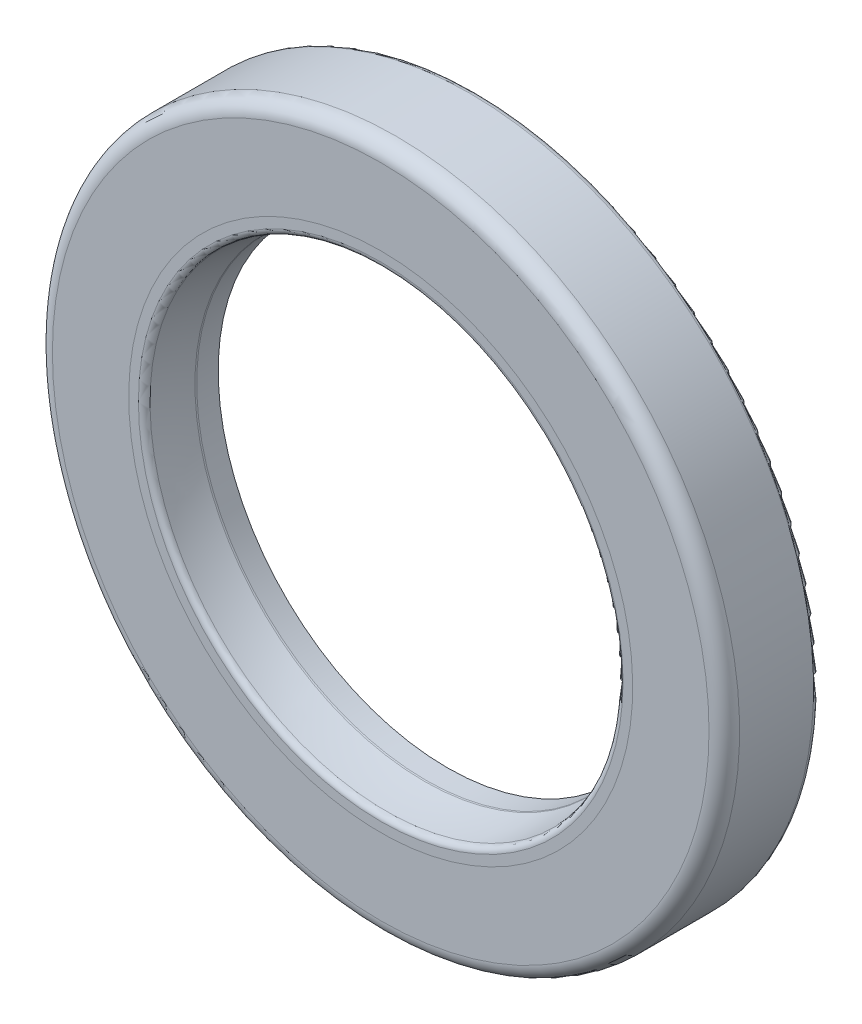
ISO-10303-21;
HEADER;
FILE_DESCRIPTION(('STEP AP214'),'2;1');
FILE_NAME('part.step','',(''),(''),'','','');
FILE_SCHEMA(('AUTOMOTIVE_DESIGN { 1 0 10303 214 1 1 1 1 }'));
ENDSEC;
DATA;
#1=APPLICATION_CONTEXT('core data for automotive mechanical design processes');
#2=APPLICATION_PROTOCOL_DEFINITION('international standard','automotive_design',2000,#1);
#3=PRODUCT_CONTEXT('',#1,'mechanical');
#4=PRODUCT('Part','Part','',(#3));
#5=PRODUCT_RELATED_PRODUCT_CATEGORY('part','',(#4));
#6=PRODUCT_DEFINITION_FORMATION('','',#4);
#7=PRODUCT_DEFINITION_CONTEXT('part definition',#1,'design');
#8=PRODUCT_DEFINITION('design','',#6,#7);
#9=PRODUCT_DEFINITION_SHAPE('','',#8);
#10=(LENGTH_UNIT() NAMED_UNIT(*) SI_UNIT(.MILLI.,.METRE.));
#11=(NAMED_UNIT(*) PLANE_ANGLE_UNIT() SI_UNIT($,.RADIAN.));
#12=(NAMED_UNIT(*) SI_UNIT($,.STERADIAN.) SOLID_ANGLE_UNIT());
#13=UNCERTAINTY_MEASURE_WITH_UNIT(LENGTH_MEASURE(1.E-05),#10,'distance_accuracy_value','');
#14=(GEOMETRIC_REPRESENTATION_CONTEXT(3) GLOBAL_UNCERTAINTY_ASSIGNED_CONTEXT((#13)) GLOBAL_UNIT_ASSIGNED_CONTEXT((#10,
#11,#12)) REPRESENTATION_CONTEXT('',''));
#15=CARTESIAN_POINT('',(0.,0.,0.));
#16=DIRECTION('',(0.,0.,1.));
#17=DIRECTION('',(1.,0.,0.));
#18=AXIS2_PLACEMENT_3D('',#15,#16,#17);
#19=CARTESIAN_POINT('',(0.,0.,3.66929669108685));
#20=DIRECTION('',(0.,0.,-1.));
#21=DIRECTION('',(0.,1.,0.));
#22=AXIS2_PLACEMENT_3D('',#19,#20,#21);
#23=DEGENERATE_TOROIDAL_SURFACE('',#22,8.11288573735456,19.05,.F.);
#24=CARTESIAN_POINT('',(0.,0.,1.6637));
#25=DIRECTION('',(0.,0.,-1.));
#26=DIRECTION('',(0.,1.,0.));
#27=AXIS2_PLACEMENT_3D('',#24,#25,#26);
#28=CIRCLE('',#27,10.8312448025436);
#29=CARTESIAN_POINT('',(0.,10.8312448025436,1.6637));
#30=VERTEX_POINT('',#29);
#31=EDGE_CURVE('E11',#30,#30,#28,.T.);
#32=ORIENTED_EDGE('',*,*,#31,.T.);
#33=EDGE_LOOP('',(#32));
#34=FACE_BOUND('',#33,.T.);
#35=CARTESIAN_POINT('',(0.,0.,-0.402267522852527));
#36=DIRECTION('',(0.,0.,-1.));
#37=DIRECTION('',(0.,1.,0.));
#38=AXIS2_PLACEMENT_3D('',#35,#36,#37);
#39=CIRCLE('',#38,10.4969198729082);
#40=CARTESIAN_POINT('',(0.,10.4969198729082,-0.402267522852524));
#41=VERTEX_POINT('',#40);
#42=EDGE_CURVE('E77',#41,#41,#39,.T.);
#43=ORIENTED_EDGE('',*,*,#42,.F.);
#44=EDGE_LOOP('',(#43));
#45=FACE_BOUND('',#44,.T.);
#46=ADVANCED_FACE('F43',(#34,#45),#23,.F.);
#47=CARTESIAN_POINT('',(0.,10.4690115150776,1.6637));
#48=DIRECTION('',(0.,0.,1.));
#49=DIRECTION('',(0.,-1.,0.));
#50=AXIS2_PLACEMENT_3D('',#47,#48,#49);
#51=PLANE('',#50);
#52=CARTESIAN_POINT('',(0.,0.,1.6637));
#53=DIRECTION('',(0.,0.,-1.));
#54=DIRECTION('',(0.,1.,0.));
#55=AXIS2_PLACEMENT_3D('',#52,#53,#54);
#56=CIRCLE('',#55,10.4690115150776);
#57=CARTESIAN_POINT('',(0.,10.4690115150776,1.6637));
#58=VERTEX_POINT('',#57);
#59=EDGE_CURVE('E49',#58,#58,#56,.T.);
#60=ORIENTED_EDGE('',*,*,#59,.T.);
#61=EDGE_LOOP('',(#60));
#62=FACE_BOUND('',#61,.T.);
#63=ORIENTED_EDGE('',*,*,#31,.F.);
#64=EDGE_LOOP('',(#63));
#65=FACE_BOUND('',#64,.T.);
#66=ADVANCED_FACE('F85',(#62,#65),#51,.T.);
#67=CARTESIAN_POINT('',(0.,0.,1.6637));
#68=DIRECTION('',(0.,0.,-1.));
#69=DIRECTION('',(0.,1.,0.));
#70=AXIS2_PLACEMENT_3D('',#67,#68,#69);
#71=CYLINDRICAL_SURFACE('',#70,10.4690115150776);
#72=CARTESIAN_POINT('',(0.,0.,2.1717));
#73=DIRECTION('',(0.,0.,-1.));
#74=DIRECTION('',(0.,1.,0.));
#75=AXIS2_PLACEMENT_3D('',#72,#73,#74);
#76=CIRCLE('',#75,10.4690115150776);
#77=CARTESIAN_POINT('',(0.,10.4690115150776,2.1717));
#78=VERTEX_POINT('',#77);
#79=EDGE_CURVE('E53',#78,#78,#76,.T.);
#80=ORIENTED_EDGE('',*,*,#79,.T.);
#81=EDGE_LOOP('',(#80));
#82=FACE_BOUND('',#81,.T.);
#83=ORIENTED_EDGE('',*,*,#59,.F.);
#84=EDGE_LOOP('',(#83));
#85=FACE_BOUND('',#84,.T.);
#86=ADVANCED_FACE('F89',(#82,#85),#71,.T.);
#87=CARTESIAN_POINT('',(0.,10.067302124136,2.1717));
#88=DIRECTION('',(0.,0.,1.));
#89=DIRECTION('',(0.,-1.,0.));
#90=AXIS2_PLACEMENT_3D('',#87,#88,#89);
#91=PLANE('',#90);
#92=CARTESIAN_POINT('',(0.,0.,2.1717));
#93=DIRECTION('',(0.,0.,-1.));
#94=DIRECTION('',(0.,1.,0.));
#95=AXIS2_PLACEMENT_3D('',#92,#93,#94);
#96=CIRCLE('',#95,10.067302124136);
#97=CARTESIAN_POINT('',(0.,10.067302124136,2.1717));
#98=VERTEX_POINT('',#97);
#99=EDGE_CURVE('E57',#98,#98,#96,.T.);
#100=ORIENTED_EDGE('',*,*,#99,.T.);
#101=EDGE_LOOP('',(#100));
#102=FACE_BOUND('',#101,.T.);
#103=ORIENTED_EDGE('',*,*,#79,.F.);
#104=EDGE_LOOP('',(#103));
#105=FACE_BOUND('',#104,.T.);
#106=ADVANCED_FACE('F93',(#102,#105),#91,.T.);
#107=CARTESIAN_POINT('',(0.,0.,1.9177));
#108=DIRECTION('',(0.,0.,-1.));
#109=DIRECTION('',(0.,1.,0.));
#110=AXIS2_PLACEMENT_3D('',#107,#108,#109);
#111=TOROIDAL_SURFACE('',#110,10.067302124136,0.254);
#112=CARTESIAN_POINT('',(0.,0.,1.9421014763397));
#113=DIRECTION('',(0.,0.,-1.));
#114=DIRECTION('',(0.,1.,0.));
#115=AXIS2_PLACEMENT_3D('',#112,#113,#114);
#116=CIRCLE('',#115,9.81447695143276);
#117=CARTESIAN_POINT('',(0.,9.81447695143276,1.94210147633971));
#118=VERTEX_POINT('',#117);
#119=EDGE_CURVE('E62',#118,#118,#116,.T.);
#120=ORIENTED_EDGE('',*,*,#119,.T.);
#121=EDGE_LOOP('',(#120));
#122=FACE_BOUND('',#121,.T.);
#123=ORIENTED_EDGE('',*,*,#99,.F.);
#124=EDGE_LOOP('',(#123));
#125=FACE_BOUND('',#124,.T.);
#126=ADVANCED_FACE('F100',(#122,#125),#111,.T.);
#127=CARTESIAN_POINT('',(0.,0.,2.91816052992799));
#128=DIRECTION('',(0.,0.,-1.));
#129=DIRECTION('',(0.,1.,0.));
#130=AXIS2_PLACEMENT_3D('',#127,#128,#129);
#131=DEGENERATE_TOROIDAL_SURFACE('',#130,0.298529956698394,10.16,.F.);
#132=CARTESIAN_POINT('',(0.,0.,0.356411801681758));
#133=DIRECTION('',(0.,0.,-1.));
#134=DIRECTION('',(0.,1.,0.));
#135=AXIS2_PLACEMENT_3D('',#132,#133,#134);
#136=CIRCLE('',#135,9.53320658642199);
#137=CARTESIAN_POINT('',(0.,9.53320658642199,0.356411801681761));
#138=VERTEX_POINT('',#137);
#139=EDGE_CURVE('E65',#138,#138,#136,.T.);
#140=ORIENTED_EDGE('',*,*,#139,.T.);
#141=EDGE_LOOP('',(#140));
#142=FACE_BOUND('',#141,.T.);
#143=ORIENTED_EDGE('',*,*,#119,.F.);
#144=EDGE_LOOP('',(#143));
#145=FACE_BOUND('',#144,.T.);
#146=ADVANCED_FACE('F104',(#142,#145),#131,.T.);
#147=CARTESIAN_POINT('',(0.,0.,0.292368083475603));
#148=DIRECTION('',(0.,0.,-1.));
#149=DIRECTION('',(0.,1.,0.));
#150=AXIS2_PLACEMENT_3D('',#147,#148,#149);
#151=TOROIDAL_SURFACE('',#150,9.779,0.254);
#152=CARTESIAN_POINT('',(0.,0.,0.292368083475603));
#153=DIRECTION('',(0.,0.,-1.));
#154=DIRECTION('',(0.,1.,0.));
#155=AXIS2_PLACEMENT_3D('',#152,#153,#154);
#156=CIRCLE('',#155,9.525);
#157=CARTESIAN_POINT('',(0.,9.525,0.292368083475605));
#158=VERTEX_POINT('',#157);
#159=EDGE_CURVE('E68',#158,#158,#156,.T.);
#160=ORIENTED_EDGE('',*,*,#159,.T.);
#161=EDGE_LOOP('',(#160));
#162=FACE_BOUND('',#161,.T.);
#163=ORIENTED_EDGE('',*,*,#139,.F.);
#164=EDGE_LOOP('',(#163));
#165=FACE_BOUND('',#164,.T.);
#166=ADVANCED_FACE('F108',(#162,#165),#151,.T.);
#167=CARTESIAN_POINT('',(0.,0.,1.6637));
#168=DIRECTION('',(0.,0.,-1.));
#169=DIRECTION('',(0.,1.,0.));
#170=AXIS2_PLACEMENT_3D('',#167,#168,#169);
#171=CYLINDRICAL_SURFACE('',#170,9.525);
#172=CARTESIAN_POINT('',(0.,0.,-0.601980000000003));
#173=DIRECTION('',(0.,0.,-1.));
#174=DIRECTION('',(0.,1.,0.));
#175=AXIS2_PLACEMENT_3D('',#172,#173,#174);
#176=CIRCLE('',#175,9.525);
#177=CARTESIAN_POINT('',(0.,9.525,-0.601980000000001));
#178=VERTEX_POINT('',#177);
#179=EDGE_CURVE('E71',#178,#178,#176,.T.);
#180=ORIENTED_EDGE('',*,*,#179,.T.);
#181=EDGE_LOOP('',(#180));
#182=FACE_BOUND('',#181,.T.);
#183=ORIENTED_EDGE('',*,*,#159,.F.);
#184=EDGE_LOOP('',(#183));
#185=FACE_BOUND('',#184,.T.);
#186=ADVANCED_FACE('F112',(#182,#185),#171,.F.);
#187=CARTESIAN_POINT('',(0.,10.2487891314381,-0.60198));
#188=DIRECTION('',(0.,0.,-1.));
#189=DIRECTION('',(0.,1.,0.));
#190=AXIS2_PLACEMENT_3D('',#187,#188,#189);
#191=PLANE('',#190);
#192=CARTESIAN_POINT('',(0.,0.,-0.601980000000002));
#193=DIRECTION('',(0.,0.,-1.));
#194=DIRECTION('',(0.,1.,0.));
#195=AXIS2_PLACEMENT_3D('',#192,#193,#194);
#196=CIRCLE('',#195,10.2487891314381);
#197=CARTESIAN_POINT('',(0.,10.2487891314381,-0.601979999999999));
#198=VERTEX_POINT('',#197);
#199=EDGE_CURVE('E74',#198,#198,#196,.T.);
#200=ORIENTED_EDGE('',*,*,#199,.T.);
#201=EDGE_LOOP('',(#200));
#202=FACE_BOUND('',#201,.T.);
#203=ORIENTED_EDGE('',*,*,#179,.F.);
#204=EDGE_LOOP('',(#203));
#205=FACE_BOUND('',#204,.T.);
#206=ADVANCED_FACE('F116',(#202,#205),#191,.T.);
#207=CARTESIAN_POINT('',(0.,0.,-0.347980000000002));
#208=DIRECTION('',(0.,0.,-1.));
#209=DIRECTION('',(0.,1.,0.));
#210=AXIS2_PLACEMENT_3D('',#207,#208,#209);
#211=TOROIDAL_SURFACE('',#210,10.2487891314381,0.254);
#212=ORIENTED_EDGE('',*,*,#42,.T.);
#213=EDGE_LOOP('',(#212));
#214=FACE_BOUND('',#213,.T.);
#215=ORIENTED_EDGE('',*,*,#199,.F.);
#216=EDGE_LOOP('',(#215));
#217=FACE_BOUND('',#216,.T.);
#218=ADVANCED_FACE('F81',(#214,#217),#211,.T.);
#219=CLOSED_SHELL('',(#46,#66,#86,#106,#126,#146,#166,#186,#206,#218));
#220=MANIFOLD_SOLID_BREP('B2',#219);
#221=CARTESIAN_POINT('',(0.,0.,1.6637));
#222=DIRECTION('',(0.,0.,-1.));
#223=DIRECTION('',(0.,1.,0.));
#224=AXIS2_PLACEMENT_3D('',#221,#222,#223);
#225=CYLINDRICAL_SURFACE('',#224,10.4690115150776);
#226=CARTESIAN_POINT('',(0.,0.,1.6637));
#227=DIRECTION('',(0.,0.,-1.));
#228=DIRECTION('',(0.,1.,0.));
#229=AXIS2_PLACEMENT_3D('',#226,#227,#228);
#230=CIRCLE('',#229,10.4690115150776);
#231=CARTESIAN_POINT('',(0.,10.4690115150776,1.6637));
#232=VERTEX_POINT('',#231);
#233=EDGE_CURVE('E235',#232,#232,#230,.T.);
#234=ORIENTED_EDGE('',*,*,#233,.T.);
#235=EDGE_LOOP('',(#234));
#236=FACE_BOUND('',#235,.T.);
#237=CARTESIAN_POINT('',(0.,0.,2.1717));
#238=DIRECTION('',(0.,0.,-1.));
#239=DIRECTION('',(0.,1.,0.));
#240=AXIS2_PLACEMENT_3D('',#237,#238,#239);
#241=CIRCLE('',#240,10.4690115150776);
#242=CARTESIAN_POINT('',(0.,10.4690115150776,2.1717));
#243=VERTEX_POINT('',#242);
#244=EDGE_CURVE('E42',#243,#243,#241,.T.);
#245=ORIENTED_EDGE('',*,*,#244,.F.);
#246=EDGE_LOOP('',(#245));
#247=FACE_BOUND('',#246,.T.);
#248=ADVANCED_FACE('F195',(#236,#247),#225,.F.);
#249=CARTESIAN_POINT('',(0.,10.4690115150776,2.1717));
#250=DIRECTION('',(0.,0.,1.));
#251=DIRECTION('',(0.,-1.,0.));
#252=AXIS2_PLACEMENT_3D('',#249,#250,#251);
#253=PLANE('',#252);
#254=ORIENTED_EDGE('',*,*,#244,.T.);
#255=EDGE_LOOP('',(#254));
#256=FACE_BOUND('',#255,.T.);
#257=CARTESIAN_POINT('',(0.,0.,2.1717));
#258=DIRECTION('',(0.,0.,-1.));
#259=DIRECTION('',(0.,1.,0.));
#260=AXIS2_PLACEMENT_3D('',#257,#258,#259);
#261=CIRCLE('',#260,13.6398);
#262=CARTESIAN_POINT('',(0.,13.6398,2.1717));
#263=VERTEX_POINT('',#262);
#264=EDGE_CURVE('E201',#263,#263,#261,.T.);
#265=ORIENTED_EDGE('',*,*,#264,.F.);
#266=EDGE_LOOP('',(#265));
#267=FACE_BOUND('',#266,.T.);
#268=ADVANCED_FACE('F253',(#256,#267),#253,.T.);
#269=CARTESIAN_POINT('',(0.,0.,1.5367));
#270=DIRECTION('',(0.,0.,-1.));
#271=DIRECTION('',(0.,1.,0.));
#272=AXIS2_PLACEMENT_3D('',#269,#270,#271);
#273=TOROIDAL_SURFACE('',#272,13.6398,0.635000000000003);
#274=ORIENTED_EDGE('',*,*,#264,.T.);
#275=EDGE_LOOP('',(#274));
#276=FACE_BOUND('',#275,.T.);
#277=CARTESIAN_POINT('',(0.,0.,1.5367));
#278=DIRECTION('',(0.,0.,-1.));
#279=DIRECTION('',(0.,1.,0.));
#280=AXIS2_PLACEMENT_3D('',#277,#278,#279);
#281=CIRCLE('',#280,14.2748);
#282=CARTESIAN_POINT('',(0.,14.2748,1.5367));
#283=VERTEX_POINT('',#282);
#284=EDGE_CURVE('E205',#283,#283,#281,.T.);
#285=ORIENTED_EDGE('',*,*,#284,.F.);
#286=EDGE_LOOP('',(#285));
#287=FACE_BOUND('',#286,.T.);
#288=ADVANCED_FACE('F257',(#276,#287),#273,.T.);
#289=CARTESIAN_POINT('',(0.,0.,1.6637));
#290=DIRECTION('',(0.,0.,-1.));
#291=DIRECTION('',(0.,1.,0.));
#292=AXIS2_PLACEMENT_3D('',#289,#290,#291);
#293=CYLINDRICAL_SURFACE('',#292,14.2748);
#294=ORIENTED_EDGE('',*,*,#284,.T.);
#295=EDGE_LOOP('',(#294));
#296=FACE_BOUND('',#295,.T.);
#297=CARTESIAN_POINT('',(0.,0.,-1.5367));
#298=DIRECTION('',(0.,0.,-1.));
#299=DIRECTION('',(0.,1.,0.));
#300=AXIS2_PLACEMENT_3D('',#297,#298,#299);
#301=CIRCLE('',#300,14.2748);
#302=CARTESIAN_POINT('',(0.,14.2748,-1.5367));
#303=VERTEX_POINT('',#302);
#304=EDGE_CURVE('E209',#303,#303,#301,.T.);
#305=ORIENTED_EDGE('',*,*,#304,.F.);
#306=EDGE_LOOP('',(#305));
#307=FACE_BOUND('',#306,.T.);
#308=ADVANCED_FACE('F261',(#296,#307),#293,.T.);
#309=CARTESIAN_POINT('',(0.,0.,-1.5367));
#310=DIRECTION('',(0.,0.,-1.));
#311=DIRECTION('',(0.,1.,0.));
#312=AXIS2_PLACEMENT_3D('',#309,#310,#311);
#313=TOROIDAL_SURFACE('',#312,14.0208,0.254);
#314=ORIENTED_EDGE('',*,*,#304,.T.);
#315=EDGE_LOOP('',(#314));
#316=FACE_BOUND('',#315,.T.);
#317=CARTESIAN_POINT('',(0.,0.,-1.7907));
#318=DIRECTION('',(0.,0.,-1.));
#319=DIRECTION('',(0.,1.,0.));
#320=AXIS2_PLACEMENT_3D('',#317,#318,#319);
#321=CIRCLE('',#320,14.0208);
#322=CARTESIAN_POINT('',(0.,14.0208,-1.7907));
#323=VERTEX_POINT('',#322);
#324=EDGE_CURVE('E214',#323,#323,#321,.T.);
#325=ORIENTED_EDGE('',*,*,#324,.F.);
#326=EDGE_LOOP('',(#325));
#327=FACE_BOUND('',#326,.T.);
#328=ADVANCED_FACE('F267',(#316,#327),#313,.T.);
#329=CARTESIAN_POINT('',(0.,14.0208,-1.7907));
#330=DIRECTION('',(0.,0.,-1.));
#331=DIRECTION('',(0.,1.,0.));
#332=AXIS2_PLACEMENT_3D('',#329,#330,#331);
#333=PLANE('',#332);
#334=ORIENTED_EDGE('',*,*,#324,.T.);
#335=EDGE_LOOP('',(#334));
#336=FACE_BOUND('',#335,.T.);
#337=CARTESIAN_POINT('',(0.,0.,-1.7907));
#338=DIRECTION('',(0.,0.,-1.));
#339=DIRECTION('',(0.,1.,0.));
#340=AXIS2_PLACEMENT_3D('',#337,#338,#339);
#341=CIRCLE('',#340,13.5128);
#342=CARTESIAN_POINT('',(0.,13.5128,-1.7907));
#343=VERTEX_POINT('',#342);
#344=EDGE_CURVE('E217',#343,#343,#341,.T.);
#345=ORIENTED_EDGE('',*,*,#344,.F.);
#346=EDGE_LOOP('',(#345));
#347=FACE_BOUND('',#346,.T.);
#348=ADVANCED_FACE('F271',(#336,#347),#333,.T.);
#349=CARTESIAN_POINT('',(0.,0.,1.6637));
#350=DIRECTION('',(0.,0.,-1.));
#351=DIRECTION('',(0.,1.,0.));
#352=AXIS2_PLACEMENT_3D('',#349,#350,#351);
#353=CYLINDRICAL_SURFACE('',#352,13.5128);
#354=ORIENTED_EDGE('',*,*,#344,.T.);
#355=EDGE_LOOP('',(#354));
#356=FACE_BOUND('',#355,.T.);
#357=CARTESIAN_POINT('',(0.,0.,-1.5367));
#358=DIRECTION('',(0.,0.,-1.));
#359=DIRECTION('',(0.,1.,0.));
#360=AXIS2_PLACEMENT_3D('',#357,#358,#359);
#361=CIRCLE('',#360,13.5128);
#362=CARTESIAN_POINT('',(0.,13.5128,-1.5367));
#363=VERTEX_POINT('',#362);
#364=EDGE_CURVE('E220',#363,#363,#361,.T.);
#365=ORIENTED_EDGE('',*,*,#364,.F.);
#366=EDGE_LOOP('',(#365));
#367=FACE_BOUND('',#366,.T.);
#368=ADVANCED_FACE('F275',(#356,#367),#353,.F.);
#369=CARTESIAN_POINT('',(0.,13.5128,-1.5367));
#370=DIRECTION('',(0.,0.,1.));
#371=DIRECTION('',(0.,-1.,0.));
#372=AXIS2_PLACEMENT_3D('',#369,#370,#371);
#373=PLANE('',#372);
#374=ORIENTED_EDGE('',*,*,#364,.T.);
#375=EDGE_LOOP('',(#374));
#376=FACE_BOUND('',#375,.T.);
#377=CARTESIAN_POINT('',(0.,0.,-1.5367));
#378=DIRECTION('',(0.,0.,-1.));
#379=DIRECTION('',(0.,1.,0.));
#380=AXIS2_PLACEMENT_3D('',#377,#378,#379);
#381=CIRCLE('',#380,13.7668);
#382=CARTESIAN_POINT('',(0.,13.7668,-1.5367));
#383=VERTEX_POINT('',#382);
#384=EDGE_CURVE('E223',#383,#383,#381,.T.);
#385=ORIENTED_EDGE('',*,*,#384,.F.);
#386=EDGE_LOOP('',(#385));
#387=FACE_BOUND('',#386,.T.);
#388=ADVANCED_FACE('F279',(#376,#387),#373,.T.);
#389=CARTESIAN_POINT('',(0.,0.,-1.2827));
#390=DIRECTION('',(0.,0.,-1.));
#391=DIRECTION('',(0.,1.,0.));
#392=AXIS2_PLACEMENT_3D('',#389,#390,#391);
#393=TOROIDAL_SURFACE('',#392,13.7668,0.254);
#394=ORIENTED_EDGE('',*,*,#384,.T.);
#395=EDGE_LOOP('',(#394));
#396=FACE_BOUND('',#395,.T.);
#397=CARTESIAN_POINT('',(0.,0.,-1.0287));
#398=DIRECTION('',(0.,0.,-1.));
#399=DIRECTION('',(0.,1.,0.));
#400=AXIS2_PLACEMENT_3D('',#397,#398,#399);
#401=CIRCLE('',#400,13.7668);
#402=CARTESIAN_POINT('',(0.,13.7668,-1.0287));
#403=VERTEX_POINT('',#402);
#404=EDGE_CURVE('E226',#403,#403,#401,.T.);
#405=ORIENTED_EDGE('',*,*,#404,.F.);
#406=EDGE_LOOP('',(#405));
#407=FACE_BOUND('',#406,.T.);
#408=ADVANCED_FACE('F283',(#396,#407),#393,.F.);
#409=CARTESIAN_POINT('',(0.,0.,1.6637));
#410=DIRECTION('',(0.,0.,-1.));
#411=DIRECTION('',(0.,1.,0.));
#412=AXIS2_PLACEMENT_3D('',#409,#410,#411);
#413=CYLINDRICAL_SURFACE('',#412,13.7668);
#414=ORIENTED_EDGE('',*,*,#404,.T.);
#415=EDGE_LOOP('',(#414));
#416=FACE_BOUND('',#415,.T.);
#417=CARTESIAN_POINT('',(0.,0.,1.6002));
#418=DIRECTION('',(0.,0.,-1.));
#419=DIRECTION('',(0.,1.,0.));
#420=AXIS2_PLACEMENT_3D('',#417,#418,#419);
#421=CIRCLE('',#420,13.7668);
#422=CARTESIAN_POINT('',(0.,13.7668,1.6002));
#423=VERTEX_POINT('',#422);
#424=EDGE_CURVE('E229',#423,#423,#421,.T.);
#425=ORIENTED_EDGE('',*,*,#424,.F.);
#426=EDGE_LOOP('',(#425));
#427=FACE_BOUND('',#426,.T.);
#428=ADVANCED_FACE('F249',(#416,#427),#413,.F.);
#429=CARTESIAN_POINT('',(0.,0.,1.6002));
#430=DIRECTION('',(0.,0.,-1.));
#431=DIRECTION('',(0.,1.,0.));
#432=AXIS2_PLACEMENT_3D('',#429,#430,#431);
#433=TOROIDAL_SURFACE('',#432,13.7033,0.0634999999999998);
#434=ORIENTED_EDGE('',*,*,#424,.T.);
#435=EDGE_LOOP('',(#434));
#436=FACE_BOUND('',#435,.T.);
#437=CARTESIAN_POINT('',(0.,0.,1.6637));
#438=DIRECTION('',(0.,0.,-1.));
#439=DIRECTION('',(0.,1.,0.));
#440=AXIS2_PLACEMENT_3D('',#437,#438,#439);
#441=CIRCLE('',#440,13.7033);
#442=CARTESIAN_POINT('',(0.,13.7033,1.6637));
#443=VERTEX_POINT('',#442);
#444=EDGE_CURVE('E232',#443,#443,#441,.T.);
#445=ORIENTED_EDGE('',*,*,#444,.F.);
#446=EDGE_LOOP('',(#445));
#447=FACE_BOUND('',#446,.T.);
#448=ADVANCED_FACE('F243',(#436,#447),#433,.F.);
#449=CARTESIAN_POINT('',(0.,13.7033,1.6637));
#450=DIRECTION('',(0.,0.,-1.));
#451=DIRECTION('',(0.,1.,0.));
#452=AXIS2_PLACEMENT_3D('',#449,#450,#451);
#453=PLANE('',#452);
#454=ORIENTED_EDGE('',*,*,#444,.T.);
#455=EDGE_LOOP('',(#454));
#456=FACE_BOUND('',#455,.T.);
#457=ORIENTED_EDGE('',*,*,#233,.F.);
#458=EDGE_LOOP('',(#457));
#459=FACE_BOUND('',#458,.T.);
#460=ADVANCED_FACE('F241',(#456,#459),#453,.T.);
#461=CLOSED_SHELL('',(#248,#268,#288,#308,#328,#348,#368,#388,#408,#428,#448,#460));
#462=MANIFOLD_SOLID_BREP('B6',#461);
#463=ADVANCED_BREP_SHAPE_REPRESENTATION('',(#18,#220,#462),#14);
#464=SHAPE_DEFINITION_REPRESENTATION(#9,#463);
ENDSEC;
END-ISO-10303-21;
